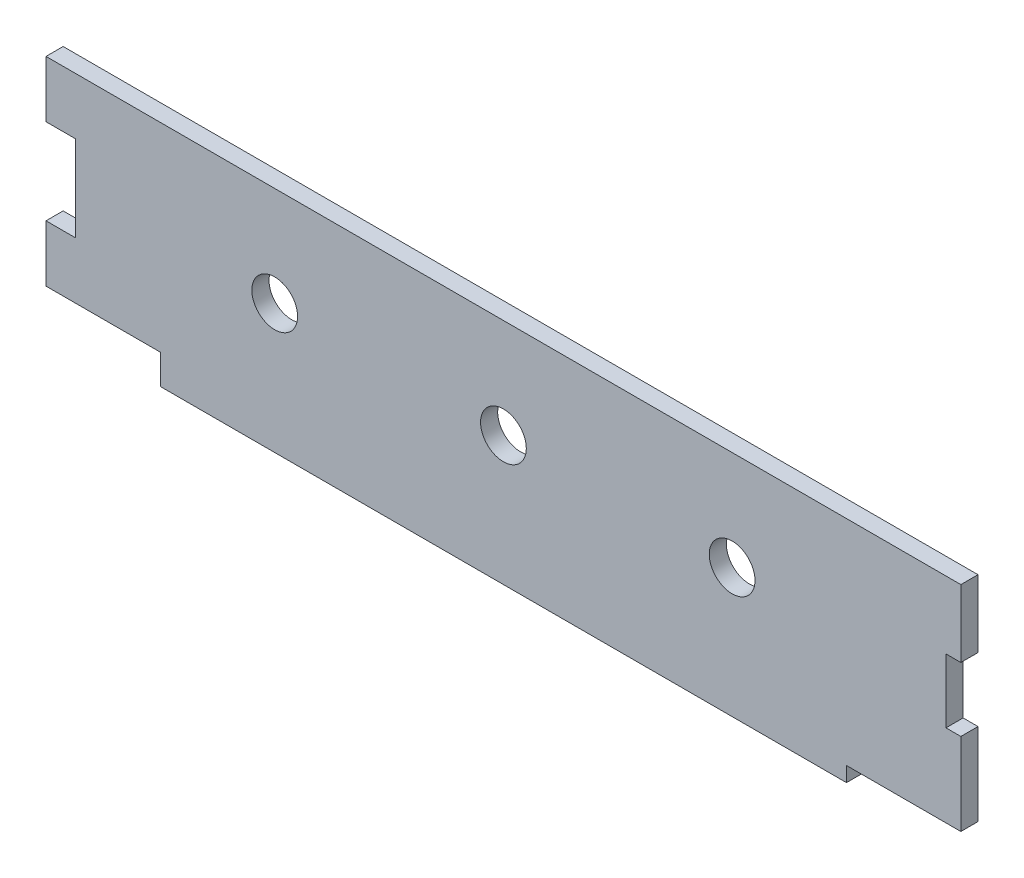
ISO-10303-21;
HEADER;
FILE_DESCRIPTION(('STEP AP214'),'2;1');
FILE_NAME('part.step','',(''),(''),'','','');
FILE_SCHEMA(('AUTOMOTIVE_DESIGN { 1 0 10303 214 1 1 1 1 }'));
ENDSEC;
DATA;
#1=APPLICATION_CONTEXT('core data for automotive mechanical design processes');
#2=APPLICATION_PROTOCOL_DEFINITION('international standard','automotive_design',2000,#1);
#3=PRODUCT_CONTEXT('',#1,'mechanical');
#4=PRODUCT('Part','Part','',(#3));
#5=PRODUCT_RELATED_PRODUCT_CATEGORY('part','',(#4));
#6=PRODUCT_DEFINITION_FORMATION('','',#4);
#7=PRODUCT_DEFINITION_CONTEXT('part definition',#1,'design');
#8=PRODUCT_DEFINITION('design','',#6,#7);
#9=PRODUCT_DEFINITION_SHAPE('','',#8);
#10=(LENGTH_UNIT() NAMED_UNIT(*) SI_UNIT(.MILLI.,.METRE.));
#11=(NAMED_UNIT(*) PLANE_ANGLE_UNIT() SI_UNIT($,.RADIAN.));
#12=(NAMED_UNIT(*) SI_UNIT($,.STERADIAN.) SOLID_ANGLE_UNIT());
#13=UNCERTAINTY_MEASURE_WITH_UNIT(LENGTH_MEASURE(1.E-05),#10,'distance_accuracy_value','');
#14=(GEOMETRIC_REPRESENTATION_CONTEXT(3) GLOBAL_UNCERTAINTY_ASSIGNED_CONTEXT((#13)) GLOBAL_UNIT_ASSIGNED_CONTEXT((#10,
#11,#12)) REPRESENTATION_CONTEXT('',''));
#15=CARTESIAN_POINT('',(0.,0.,0.));
#16=DIRECTION('',(0.,0.,1.));
#17=DIRECTION('',(1.,0.,0.));
#18=AXIS2_PLACEMENT_3D('',#15,#16,#17);
#19=CARTESIAN_POINT('',(0.,0.,1.5));
#20=DIRECTION('',(0.,0.,-1.));
#21=DIRECTION('',(-1.,0.,0.));
#22=AXIS2_PLACEMENT_3D('',#19,#20,#21);
#23=PLANE('',#22);
#24=DIRECTION('',(0.,-1.,0.));
#25=VECTOR('',#24,1.);
#26=CARTESIAN_POINT('',(-40.,3.74999999999999,1.5));
#27=LINE('',#26,#25);
#28=CARTESIAN_POINT('',(-40.0000000000001,8.7,1.5));
#29=VERTEX_POINT('',#28);
#30=CARTESIAN_POINT('',(-40.,3.74999999999999,1.5));
#31=VERTEX_POINT('',#30);
#32=EDGE_CURVE('E209',#29,#31,#27,.T.);
#33=ORIENTED_EDGE('',*,*,#32,.T.);
#34=DIRECTION('',(1.,0.,0.));
#35=VECTOR('',#34,1.);
#36=CARTESIAN_POINT('',(-37.4,3.74999999999999,1.5));
#37=LINE('',#36,#35);
#38=CARTESIAN_POINT('',(-37.4,3.74999999999999,1.5));
#39=VERTEX_POINT('',#38);
#40=EDGE_CURVE('E117',#31,#39,#37,.T.);
#41=ORIENTED_EDGE('',*,*,#40,.T.);
#42=DIRECTION('',(0.,-1.,0.));
#43=VECTOR('',#42,1.);
#44=CARTESIAN_POINT('',(-37.4,-3.75000000000001,1.5));
#45=LINE('',#44,#43);
#46=CARTESIAN_POINT('',(-37.4,-3.75000000000001,1.5));
#47=VERTEX_POINT('',#46);
#48=EDGE_CURVE('E248',#39,#47,#45,.T.);
#49=ORIENTED_EDGE('',*,*,#48,.T.);
#50=DIRECTION('',(-1.,0.,0.));
#51=VECTOR('',#50,1.);
#52=CARTESIAN_POINT('',(-40.,-3.75000000000001,1.5));
#53=LINE('',#52,#51);
#54=CARTESIAN_POINT('',(-40.,-3.75000000000001,1.5));
#55=VERTEX_POINT('',#54);
#56=EDGE_CURVE('E267',#47,#55,#53,.T.);
#57=ORIENTED_EDGE('',*,*,#56,.T.);
#58=DIRECTION('',(0.,-1.,0.));
#59=VECTOR('',#58,1.);
#60=CARTESIAN_POINT('',(-40.,-8.70000000000001,1.5));
#61=LINE('',#60,#59);
#62=CARTESIAN_POINT('',(-40.,-8.70000000000001,1.5));
#63=VERTEX_POINT('',#62);
#64=EDGE_CURVE('E264',#55,#63,#61,.T.);
#65=ORIENTED_EDGE('',*,*,#64,.T.);
#66=DIRECTION('',(1.,0.,0.));
#67=VECTOR('',#66,1.);
#68=CARTESIAN_POINT('',(-30.,-8.70000000000001,1.5));
#69=LINE('',#68,#67);
#70=CARTESIAN_POINT('',(-30.,-8.70000000000001,1.5));
#71=VERTEX_POINT('',#70);
#72=EDGE_CURVE('E266',#63,#71,#69,.T.);
#73=ORIENTED_EDGE('',*,*,#72,.T.);
#74=DIRECTION('',(0.,-1.,0.));
#75=VECTOR('',#74,1.);
#76=CARTESIAN_POINT('',(-30.,-11.3,1.5));
#77=LINE('',#76,#75);
#78=CARTESIAN_POINT('',(-30.,-11.3,1.5));
#79=VERTEX_POINT('',#78);
#80=EDGE_CURVE('E269',#71,#79,#77,.T.);
#81=ORIENTED_EDGE('',*,*,#80,.T.);
#82=DIRECTION('',(1.,0.,0.));
#83=VECTOR('',#82,1.);
#84=CARTESIAN_POINT('',(30.,-11.3,1.5));
#85=LINE('',#84,#83);
#86=CARTESIAN_POINT('',(30.,-11.3,1.5));
#87=VERTEX_POINT('',#86);
#88=EDGE_CURVE('E275',#79,#87,#85,.T.);
#89=ORIENTED_EDGE('',*,*,#88,.T.);
#90=DIRECTION('',(0.,1.,0.));
#91=VECTOR('',#90,1.);
#92=CARTESIAN_POINT('',(30.,-9.99999999999999,1.5));
#93=LINE('',#92,#91);
#94=CARTESIAN_POINT('',(30.,-9.99999999999999,1.5));
#95=VERTEX_POINT('',#94);
#96=EDGE_CURVE('E277',#87,#95,#93,.T.);
#97=ORIENTED_EDGE('',*,*,#96,.T.);
#98=DIRECTION('',(1.,0.,0.));
#99=VECTOR('',#98,1.);
#100=CARTESIAN_POINT('',(40.,-9.99999999999999,1.5));
#101=LINE('',#100,#99);
#102=CARTESIAN_POINT('',(40.,-9.99999999999999,1.5));
#103=VERTEX_POINT('',#102);
#104=EDGE_CURVE('E279',#95,#103,#101,.T.);
#105=ORIENTED_EDGE('',*,*,#104,.T.);
#106=DIRECTION('',(0.,1.,0.));
#107=VECTOR('',#106,1.);
#108=CARTESIAN_POINT('',(40.,-2.8,1.5));
#109=LINE('',#108,#107);
#110=CARTESIAN_POINT('',(40.,-2.8,1.5));
#111=VERTEX_POINT('',#110);
#112=EDGE_CURVE('E281',#103,#111,#109,.T.);
#113=ORIENTED_EDGE('',*,*,#112,.T.);
#114=DIRECTION('',(-1.,0.,0.));
#115=VECTOR('',#114,1.);
#116=CARTESIAN_POINT('',(38.7,-2.8,1.5));
#117=LINE('',#116,#115);
#118=CARTESIAN_POINT('',(38.7,-2.8,1.5));
#119=VERTEX_POINT('',#118);
#120=EDGE_CURVE('E283',#111,#119,#117,.T.);
#121=ORIENTED_EDGE('',*,*,#120,.T.);
#122=DIRECTION('',(0.,1.,0.));
#123=VECTOR('',#122,1.);
#124=CARTESIAN_POINT('',(38.7,2.8,1.5));
#125=LINE('',#124,#123);
#126=CARTESIAN_POINT('',(38.7,2.8,1.5));
#127=VERTEX_POINT('',#126);
#128=EDGE_CURVE('E160',#119,#127,#125,.T.);
#129=ORIENTED_EDGE('',*,*,#128,.T.);
#130=DIRECTION('',(1.,0.,0.));
#131=VECTOR('',#130,1.);
#132=CARTESIAN_POINT('',(40.,2.8,1.5));
#133=LINE('',#132,#131);
#134=CARTESIAN_POINT('',(40.,2.8,1.5));
#135=VERTEX_POINT('',#134);
#136=EDGE_CURVE('E154',#127,#135,#133,.T.);
#137=ORIENTED_EDGE('',*,*,#136,.T.);
#138=DIRECTION('',(0.,1.,0.));
#139=VECTOR('',#138,1.);
#140=CARTESIAN_POINT('',(40.0000000000001,8.7,1.5));
#141=LINE('',#140,#139);
#142=CARTESIAN_POINT('',(40.0000000000001,8.7,1.5));
#143=VERTEX_POINT('',#142);
#144=EDGE_CURVE('E158',#135,#143,#141,.T.);
#145=ORIENTED_EDGE('',*,*,#144,.T.);
#146=DIRECTION('',(-1.,0.,0.));
#147=VECTOR('',#146,1.);
#148=CARTESIAN_POINT('',(-40.0000000000001,8.7,1.5));
#149=LINE('',#148,#147);
#150=EDGE_CURVE('E50',#143,#29,#149,.T.);
#151=ORIENTED_EDGE('',*,*,#150,.T.);
#152=EDGE_LOOP('',(#33,#41,#49,#57,#65,#73,#81,#89,#97,#105,#113,#121,#129,#137,#145,#151));
#153=FACE_BOUND('',#152,.T.);
#154=CARTESIAN_POINT('',(20.,0.,1.5));
#155=DIRECTION('',(0.,0.,1.));
#156=DIRECTION('',(1.,0.,0.));
#157=AXIS2_PLACEMENT_3D('',#154,#155,#156);
#158=CIRCLE('',#157,2.00000000000003);
#159=CARTESIAN_POINT('',(22.,0.,1.5));
#160=VERTEX_POINT('',#159);
#161=EDGE_CURVE('E182',#160,#160,#158,.T.);
#162=ORIENTED_EDGE('',*,*,#161,.F.);
#163=EDGE_LOOP('',(#162));
#164=FACE_BOUND('',#163,.T.);
#165=CARTESIAN_POINT('',(0.,0.,1.5));
#166=DIRECTION('',(0.,0.,1.));
#167=DIRECTION('',(1.,0.,0.));
#168=AXIS2_PLACEMENT_3D('',#165,#166,#167);
#169=CIRCLE('',#168,2.00000000000002);
#170=CARTESIAN_POINT('',(2.,0.,1.5));
#171=VERTEX_POINT('',#170);
#172=EDGE_CURVE('E337',#171,#171,#169,.T.);
#173=ORIENTED_EDGE('',*,*,#172,.F.);
#174=EDGE_LOOP('',(#173));
#175=FACE_BOUND('',#174,.T.);
#176=CARTESIAN_POINT('',(-20.,0.,1.5));
#177=DIRECTION('',(0.,0.,1.));
#178=DIRECTION('',(1.,0.,0.));
#179=AXIS2_PLACEMENT_3D('',#176,#177,#178);
#180=CIRCLE('',#179,2.00000000000003);
#181=CARTESIAN_POINT('',(-18.,0.,1.5));
#182=VERTEX_POINT('',#181);
#183=EDGE_CURVE('E328',#182,#182,#180,.T.);
#184=ORIENTED_EDGE('',*,*,#183,.F.);
#185=EDGE_LOOP('',(#184));
#186=FACE_BOUND('',#185,.T.);
#187=ADVANCED_FACE('F33',(#153,#164,#175,#186),#23,.F.);
#188=CARTESIAN_POINT('',(0.,0.,0.));
#189=DIRECTION('',(0.,0.,-1.));
#190=DIRECTION('',(-1.,0.,0.));
#191=AXIS2_PLACEMENT_3D('',#188,#189,#190);
#192=PLANE('',#191);
#193=CARTESIAN_POINT('',(0.,0.,0.));
#194=DIRECTION('',(0.,0.,1.));
#195=DIRECTION('',(1.,0.,0.));
#196=AXIS2_PLACEMENT_3D('',#193,#194,#195);
#197=CIRCLE('',#196,2.00000000000002);
#198=CARTESIAN_POINT('',(2.,0.,0.));
#199=VERTEX_POINT('',#198);
#200=EDGE_CURVE('E334',#199,#199,#197,.T.);
#201=ORIENTED_EDGE('',*,*,#200,.T.);
#202=EDGE_LOOP('',(#201));
#203=FACE_BOUND('',#202,.T.);
#204=DIRECTION('',(0.,-1.,0.));
#205=VECTOR('',#204,1.);
#206=CARTESIAN_POINT('',(-40.,3.74999999999999,0.));
#207=LINE('',#206,#205);
#208=CARTESIAN_POINT('',(-40.0000000000001,8.7,0.));
#209=VERTEX_POINT('',#208);
#210=CARTESIAN_POINT('',(-40.,3.74999999999999,0.));
#211=VERTEX_POINT('',#210);
#212=EDGE_CURVE('E178',#209,#211,#207,.T.);
#213=ORIENTED_EDGE('',*,*,#212,.F.);
#214=DIRECTION('',(-1.,0.,0.));
#215=VECTOR('',#214,1.);
#216=CARTESIAN_POINT('',(-40.0000000000001,8.7,0.));
#217=LINE('',#216,#215);
#218=CARTESIAN_POINT('',(40.0000000000001,8.7,0.));
#219=VERTEX_POINT('',#218);
#220=EDGE_CURVE('E109',#219,#209,#217,.T.);
#221=ORIENTED_EDGE('',*,*,#220,.F.);
#222=DIRECTION('',(0.,1.,0.));
#223=VECTOR('',#222,1.);
#224=CARTESIAN_POINT('',(40.0000000000001,8.7,0.));
#225=LINE('',#224,#223);
#226=CARTESIAN_POINT('',(40.,2.8,0.));
#227=VERTEX_POINT('',#226);
#228=EDGE_CURVE('E103',#227,#219,#225,.T.);
#229=ORIENTED_EDGE('',*,*,#228,.F.);
#230=DIRECTION('',(1.,0.,0.));
#231=VECTOR('',#230,1.);
#232=CARTESIAN_POINT('',(40.,2.8,0.));
#233=LINE('',#232,#231);
#234=CARTESIAN_POINT('',(38.7,2.8,0.));
#235=VERTEX_POINT('',#234);
#236=EDGE_CURVE('E168',#235,#227,#233,.T.);
#237=ORIENTED_EDGE('',*,*,#236,.F.);
#238=DIRECTION('',(0.,1.,0.));
#239=VECTOR('',#238,1.);
#240=CARTESIAN_POINT('',(38.7,2.8,0.));
#241=LINE('',#240,#239);
#242=CARTESIAN_POINT('',(38.7,-2.8,0.));
#243=VERTEX_POINT('',#242);
#244=EDGE_CURVE('E204',#243,#235,#241,.T.);
#245=ORIENTED_EDGE('',*,*,#244,.F.);
#246=DIRECTION('',(-1.,0.,0.));
#247=VECTOR('',#246,1.);
#248=CARTESIAN_POINT('',(38.7,-2.8,0.));
#249=LINE('',#248,#247);
#250=CARTESIAN_POINT('',(40.,-2.8,0.));
#251=VERTEX_POINT('',#250);
#252=EDGE_CURVE('E202',#251,#243,#249,.T.);
#253=ORIENTED_EDGE('',*,*,#252,.F.);
#254=DIRECTION('',(0.,1.,0.));
#255=VECTOR('',#254,1.);
#256=CARTESIAN_POINT('',(40.,-2.8,0.));
#257=LINE('',#256,#255);
#258=CARTESIAN_POINT('',(40.,-9.99999999999999,0.));
#259=VERTEX_POINT('',#258);
#260=EDGE_CURVE('E200',#259,#251,#257,.T.);
#261=ORIENTED_EDGE('',*,*,#260,.F.);
#262=DIRECTION('',(1.,0.,0.));
#263=VECTOR('',#262,1.);
#264=CARTESIAN_POINT('',(40.,-9.99999999999999,0.));
#265=LINE('',#264,#263);
#266=CARTESIAN_POINT('',(30.,-9.99999999999999,0.));
#267=VERTEX_POINT('',#266);
#268=EDGE_CURVE('E198',#267,#259,#265,.T.);
#269=ORIENTED_EDGE('',*,*,#268,.F.);
#270=DIRECTION('',(0.,1.,0.));
#271=VECTOR('',#270,1.);
#272=CARTESIAN_POINT('',(30.,-9.99999999999999,0.));
#273=LINE('',#272,#271);
#274=CARTESIAN_POINT('',(30.,-11.3,0.));
#275=VERTEX_POINT('',#274);
#276=EDGE_CURVE('E196',#275,#267,#273,.T.);
#277=ORIENTED_EDGE('',*,*,#276,.F.);
#278=DIRECTION('',(1.,0.,0.));
#279=VECTOR('',#278,1.);
#280=CARTESIAN_POINT('',(30.,-11.3,0.));
#281=LINE('',#280,#279);
#282=CARTESIAN_POINT('',(-30.,-11.3,0.));
#283=VERTEX_POINT('',#282);
#284=EDGE_CURVE('E194',#283,#275,#281,.T.);
#285=ORIENTED_EDGE('',*,*,#284,.F.);
#286=DIRECTION('',(0.,-1.,0.));
#287=VECTOR('',#286,1.);
#288=CARTESIAN_POINT('',(-30.,-11.3,0.));
#289=LINE('',#288,#287);
#290=CARTESIAN_POINT('',(-30.,-8.70000000000001,0.));
#291=VERTEX_POINT('',#290);
#292=EDGE_CURVE('E192',#291,#283,#289,.T.);
#293=ORIENTED_EDGE('',*,*,#292,.F.);
#294=DIRECTION('',(1.,0.,0.));
#295=VECTOR('',#294,1.);
#296=CARTESIAN_POINT('',(-30.,-8.70000000000001,0.));
#297=LINE('',#296,#295);
#298=CARTESIAN_POINT('',(-40.,-8.70000000000001,0.));
#299=VERTEX_POINT('',#298);
#300=EDGE_CURVE('E190',#299,#291,#297,.T.);
#301=ORIENTED_EDGE('',*,*,#300,.F.);
#302=DIRECTION('',(0.,-1.,0.));
#303=VECTOR('',#302,1.);
#304=CARTESIAN_POINT('',(-40.,-8.70000000000001,0.));
#305=LINE('',#304,#303);
#306=CARTESIAN_POINT('',(-40.,-3.75000000000001,0.));
#307=VERTEX_POINT('',#306);
#308=EDGE_CURVE('E188',#307,#299,#305,.T.);
#309=ORIENTED_EDGE('',*,*,#308,.F.);
#310=DIRECTION('',(-1.,0.,0.));
#311=VECTOR('',#310,1.);
#312=CARTESIAN_POINT('',(-40.,-3.75000000000001,0.));
#313=LINE('',#312,#311);
#314=CARTESIAN_POINT('',(-37.4,-3.75000000000001,0.));
#315=VERTEX_POINT('',#314);
#316=EDGE_CURVE('E186',#315,#307,#313,.T.);
#317=ORIENTED_EDGE('',*,*,#316,.F.);
#318=DIRECTION('',(0.,-1.,0.));
#319=VECTOR('',#318,1.);
#320=CARTESIAN_POINT('',(-37.4,-3.75000000000001,0.));
#321=LINE('',#320,#319);
#322=CARTESIAN_POINT('',(-37.4,3.74999999999999,0.));
#323=VERTEX_POINT('',#322);
#324=EDGE_CURVE('E184',#323,#315,#321,.T.);
#325=ORIENTED_EDGE('',*,*,#324,.F.);
#326=DIRECTION('',(1.,0.,0.));
#327=VECTOR('',#326,1.);
#328=CARTESIAN_POINT('',(-37.4,3.74999999999999,0.));
#329=LINE('',#328,#327);
#330=EDGE_CURVE('E181',#211,#323,#329,.T.);
#331=ORIENTED_EDGE('',*,*,#330,.F.);
#332=EDGE_LOOP('',(#213,#221,#229,#237,#245,#253,#261,#269,#277,#285,#293,#301,#309,#317,#325,#331));
#333=FACE_BOUND('',#332,.T.);
#334=CARTESIAN_POINT('',(20.,0.,0.));
#335=DIRECTION('',(0.,0.,1.));
#336=DIRECTION('',(1.,0.,0.));
#337=AXIS2_PLACEMENT_3D('',#334,#335,#336);
#338=CIRCLE('',#337,2.00000000000003);
#339=CARTESIAN_POINT('',(22.,0.,0.));
#340=VERTEX_POINT('',#339);
#341=EDGE_CURVE('E340',#340,#340,#338,.T.);
#342=ORIENTED_EDGE('',*,*,#341,.T.);
#343=EDGE_LOOP('',(#342));
#344=FACE_BOUND('',#343,.T.);
#345=CARTESIAN_POINT('',(-20.,0.,0.));
#346=DIRECTION('',(0.,0.,1.));
#347=DIRECTION('',(1.,0.,0.));
#348=AXIS2_PLACEMENT_3D('',#345,#346,#347);
#349=CIRCLE('',#348,2.00000000000003);
#350=CARTESIAN_POINT('',(-18.,0.,0.));
#351=VERTEX_POINT('',#350);
#352=EDGE_CURVE('E331',#351,#351,#349,.T.);
#353=ORIENTED_EDGE('',*,*,#352,.T.);
#354=EDGE_LOOP('',(#353));
#355=FACE_BOUND('',#354,.T.);
#356=ADVANCED_FACE('F252',(#203,#333,#344,#355),#192,.T.);
#357=CARTESIAN_POINT('',(-40.,3.74999999999999,1.5));
#358=DIRECTION('',(1.,0.,0.));
#359=DIRECTION('',(0.,1.,0.));
#360=AXIS2_PLACEMENT_3D('',#357,#358,#359);
#361=PLANE('',#360);
#362=ORIENTED_EDGE('',*,*,#212,.T.);
#363=DIRECTION('',(0.,0.,-1.));
#364=VECTOR('',#363,1.);
#365=CARTESIAN_POINT('',(-40.,3.74999999999999,1.5));
#366=LINE('',#365,#364);
#367=EDGE_CURVE('E11',#31,#211,#366,.T.);
#368=ORIENTED_EDGE('',*,*,#367,.F.);
#369=ORIENTED_EDGE('',*,*,#32,.F.);
#370=DIRECTION('',(0.,0.,-1.));
#371=VECTOR('',#370,1.);
#372=CARTESIAN_POINT('',(-40.0000000000001,8.7,1.5));
#373=LINE('',#372,#371);
#374=EDGE_CURVE('E174',#29,#209,#373,.T.);
#375=ORIENTED_EDGE('',*,*,#374,.T.);
#376=EDGE_LOOP('',(#362,#368,#369,#375));
#377=FACE_BOUND('',#376,.T.);
#378=ADVANCED_FACE('F35',(#377),#361,.F.);
#379=CARTESIAN_POINT('',(-37.4,3.74999999999999,1.5));
#380=DIRECTION('',(0.,1.,0.));
#381=DIRECTION('',(-1.,0.,0.));
#382=AXIS2_PLACEMENT_3D('',#379,#380,#381);
#383=PLANE('',#382);
#384=ORIENTED_EDGE('',*,*,#330,.T.);
#385=DIRECTION('',(0.,0.,-1.));
#386=VECTOR('',#385,1.);
#387=CARTESIAN_POINT('',(-37.4,3.74999999999999,1.5));
#388=LINE('',#387,#386);
#389=EDGE_CURVE('E42',#39,#323,#388,.T.);
#390=ORIENTED_EDGE('',*,*,#389,.F.);
#391=ORIENTED_EDGE('',*,*,#40,.F.);
#392=ORIENTED_EDGE('',*,*,#367,.T.);
#393=EDGE_LOOP('',(#384,#390,#391,#392));
#394=FACE_BOUND('',#393,.T.);
#395=ADVANCED_FACE('F483',(#394),#383,.F.);
#396=CARTESIAN_POINT('',(-37.4,-3.75000000000001,1.5));
#397=DIRECTION('',(1.,0.,0.));
#398=DIRECTION('',(0.,1.,0.));
#399=AXIS2_PLACEMENT_3D('',#396,#397,#398);
#400=PLANE('',#399);
#401=ORIENTED_EDGE('',*,*,#324,.T.);
#402=DIRECTION('',(0.,0.,-1.));
#403=VECTOR('',#402,1.);
#404=CARTESIAN_POINT('',(-37.4,-3.75000000000001,1.5));
#405=LINE('',#404,#403);
#406=EDGE_CURVE('E240',#47,#315,#405,.T.);
#407=ORIENTED_EDGE('',*,*,#406,.F.);
#408=ORIENTED_EDGE('',*,*,#48,.F.);
#409=ORIENTED_EDGE('',*,*,#389,.T.);
#410=EDGE_LOOP('',(#401,#407,#408,#409));
#411=FACE_BOUND('',#410,.T.);
#412=ADVANCED_FACE('F246',(#411),#400,.F.);
#413=CARTESIAN_POINT('',(-40.,-3.75000000000001,1.5));
#414=DIRECTION('',(0.,-1.,0.));
#415=DIRECTION('',(0.,0.,-1.));
#416=AXIS2_PLACEMENT_3D('',#413,#414,#415);
#417=PLANE('',#416);
#418=ORIENTED_EDGE('',*,*,#316,.T.);
#419=DIRECTION('',(0.,0.,-1.));
#420=VECTOR('',#419,1.);
#421=CARTESIAN_POINT('',(-40.,-3.75000000000001,1.5));
#422=LINE('',#421,#420);
#423=EDGE_CURVE('E237',#55,#307,#422,.T.);
#424=ORIENTED_EDGE('',*,*,#423,.F.);
#425=ORIENTED_EDGE('',*,*,#56,.F.);
#426=ORIENTED_EDGE('',*,*,#406,.T.);
#427=EDGE_LOOP('',(#418,#424,#425,#426));
#428=FACE_BOUND('',#427,.T.);
#429=ADVANCED_FACE('F258',(#428),#417,.F.);
#430=CARTESIAN_POINT('',(-40.,-8.70000000000001,1.5));
#431=DIRECTION('',(1.,0.,0.));
#432=DIRECTION('',(0.,1.,0.));
#433=AXIS2_PLACEMENT_3D('',#430,#431,#432);
#434=PLANE('',#433);
#435=ORIENTED_EDGE('',*,*,#308,.T.);
#436=DIRECTION('',(0.,0.,-1.));
#437=VECTOR('',#436,1.);
#438=CARTESIAN_POINT('',(-40.,-8.70000000000001,1.5));
#439=LINE('',#438,#437);
#440=EDGE_CURVE('E234',#63,#299,#439,.T.);
#441=ORIENTED_EDGE('',*,*,#440,.F.);
#442=ORIENTED_EDGE('',*,*,#64,.F.);
#443=ORIENTED_EDGE('',*,*,#423,.T.);
#444=EDGE_LOOP('',(#435,#441,#442,#443));
#445=FACE_BOUND('',#444,.T.);
#446=ADVANCED_FACE('F262',(#445),#434,.F.);
#447=CARTESIAN_POINT('',(-30.,-8.70000000000001,1.5));
#448=DIRECTION('',(0.,1.,0.));
#449=DIRECTION('',(-1.,0.,0.));
#450=AXIS2_PLACEMENT_3D('',#447,#448,#449);
#451=PLANE('',#450);
#452=ORIENTED_EDGE('',*,*,#300,.T.);
#453=DIRECTION('',(0.,0.,-1.));
#454=VECTOR('',#453,1.);
#455=CARTESIAN_POINT('',(-30.,-8.70000000000001,1.5));
#456=LINE('',#455,#454);
#457=EDGE_CURVE('E231',#71,#291,#456,.T.);
#458=ORIENTED_EDGE('',*,*,#457,.F.);
#459=ORIENTED_EDGE('',*,*,#72,.F.);
#460=ORIENTED_EDGE('',*,*,#440,.T.);
#461=EDGE_LOOP('',(#452,#458,#459,#460));
#462=FACE_BOUND('',#461,.T.);
#463=ADVANCED_FACE('F448',(#462),#451,.F.);
#464=CARTESIAN_POINT('',(-30.,-11.3,1.5));
#465=DIRECTION('',(1.,0.,0.));
#466=DIRECTION('',(0.,1.,0.));
#467=AXIS2_PLACEMENT_3D('',#464,#465,#466);
#468=PLANE('',#467);
#469=ORIENTED_EDGE('',*,*,#292,.T.);
#470=DIRECTION('',(0.,0.,-1.));
#471=VECTOR('',#470,1.);
#472=CARTESIAN_POINT('',(-30.,-11.3,1.5));
#473=LINE('',#472,#471);
#474=EDGE_CURVE('E228',#79,#283,#473,.T.);
#475=ORIENTED_EDGE('',*,*,#474,.F.);
#476=ORIENTED_EDGE('',*,*,#80,.F.);
#477=ORIENTED_EDGE('',*,*,#457,.T.);
#478=EDGE_LOOP('',(#469,#475,#476,#477));
#479=FACE_BOUND('',#478,.T.);
#480=ADVANCED_FACE('F438',(#479),#468,.F.);
#481=CARTESIAN_POINT('',(30.,-11.3,1.5));
#482=DIRECTION('',(0.,1.,0.));
#483=DIRECTION('',(-1.,0.,0.));
#484=AXIS2_PLACEMENT_3D('',#481,#482,#483);
#485=PLANE('',#484);
#486=ORIENTED_EDGE('',*,*,#284,.T.);
#487=DIRECTION('',(0.,0.,-1.));
#488=VECTOR('',#487,1.);
#489=CARTESIAN_POINT('',(30.,-11.3,1.5));
#490=LINE('',#489,#488);
#491=EDGE_CURVE('E225',#87,#275,#490,.T.);
#492=ORIENTED_EDGE('',*,*,#491,.F.);
#493=ORIENTED_EDGE('',*,*,#88,.F.);
#494=ORIENTED_EDGE('',*,*,#474,.T.);
#495=EDGE_LOOP('',(#486,#492,#493,#494));
#496=FACE_BOUND('',#495,.T.);
#497=ADVANCED_FACE('F428',(#496),#485,.F.);
#498=CARTESIAN_POINT('',(30.,-9.99999999999999,1.5));
#499=DIRECTION('',(-1.,0.,0.));
#500=DIRECTION('',(0.,-1.,0.));
#501=AXIS2_PLACEMENT_3D('',#498,#499,#500);
#502=PLANE('',#501);
#503=ORIENTED_EDGE('',*,*,#276,.T.);
#504=DIRECTION('',(0.,0.,-1.));
#505=VECTOR('',#504,1.);
#506=CARTESIAN_POINT('',(30.,-9.99999999999999,1.5));
#507=LINE('',#506,#505);
#508=EDGE_CURVE('E222',#95,#267,#507,.T.);
#509=ORIENTED_EDGE('',*,*,#508,.F.);
#510=ORIENTED_EDGE('',*,*,#96,.F.);
#511=ORIENTED_EDGE('',*,*,#491,.T.);
#512=EDGE_LOOP('',(#503,#509,#510,#511));
#513=FACE_BOUND('',#512,.T.);
#514=ADVANCED_FACE('F418',(#513),#502,.F.);
#515=CARTESIAN_POINT('',(40.,-9.99999999999999,1.5));
#516=DIRECTION('',(0.,1.,0.));
#517=DIRECTION('',(0.,0.,1.));
#518=AXIS2_PLACEMENT_3D('',#515,#516,#517);
#519=PLANE('',#518);
#520=ORIENTED_EDGE('',*,*,#268,.T.);
#521=DIRECTION('',(0.,0.,-1.));
#522=VECTOR('',#521,1.);
#523=CARTESIAN_POINT('',(40.,-9.99999999999999,1.5));
#524=LINE('',#523,#522);
#525=EDGE_CURVE('E219',#103,#259,#524,.T.);
#526=ORIENTED_EDGE('',*,*,#525,.F.);
#527=ORIENTED_EDGE('',*,*,#104,.F.);
#528=ORIENTED_EDGE('',*,*,#508,.T.);
#529=EDGE_LOOP('',(#520,#526,#527,#528));
#530=FACE_BOUND('',#529,.T.);
#531=ADVANCED_FACE('F408',(#530),#519,.F.);
#532=CARTESIAN_POINT('',(40.,-2.8,1.5));
#533=DIRECTION('',(-1.,0.,0.));
#534=DIRECTION('',(0.,-1.,0.));
#535=AXIS2_PLACEMENT_3D('',#532,#533,#534);
#536=PLANE('',#535);
#537=ORIENTED_EDGE('',*,*,#260,.T.);
#538=DIRECTION('',(0.,0.,-1.));
#539=VECTOR('',#538,1.);
#540=CARTESIAN_POINT('',(40.,-2.8,1.5));
#541=LINE('',#540,#539);
#542=EDGE_CURVE('E216',#111,#251,#541,.T.);
#543=ORIENTED_EDGE('',*,*,#542,.F.);
#544=ORIENTED_EDGE('',*,*,#112,.F.);
#545=ORIENTED_EDGE('',*,*,#525,.T.);
#546=EDGE_LOOP('',(#537,#543,#544,#545));
#547=FACE_BOUND('',#546,.T.);
#548=ADVANCED_FACE('F399',(#547),#536,.F.);
#549=CARTESIAN_POINT('',(38.7,-2.8,1.5));
#550=DIRECTION('',(0.,-1.,0.));
#551=DIRECTION('',(0.,0.,-1.));
#552=AXIS2_PLACEMENT_3D('',#549,#550,#551);
#553=PLANE('',#552);
#554=ORIENTED_EDGE('',*,*,#252,.T.);
#555=DIRECTION('',(0.,0.,-1.));
#556=VECTOR('',#555,1.);
#557=CARTESIAN_POINT('',(38.7,-2.8,1.5));
#558=LINE('',#557,#556);
#559=EDGE_CURVE('E213',#119,#243,#558,.T.);
#560=ORIENTED_EDGE('',*,*,#559,.F.);
#561=ORIENTED_EDGE('',*,*,#120,.F.);
#562=ORIENTED_EDGE('',*,*,#542,.T.);
#563=EDGE_LOOP('',(#554,#560,#561,#562));
#564=FACE_BOUND('',#563,.T.);
#565=ADVANCED_FACE('F289',(#564),#553,.F.);
#566=CARTESIAN_POINT('',(38.7,2.8,1.5));
#567=DIRECTION('',(-1.,0.,0.));
#568=DIRECTION('',(0.,0.,1.));
#569=AXIS2_PLACEMENT_3D('',#566,#567,#568);
#570=PLANE('',#569);
#571=ORIENTED_EDGE('',*,*,#244,.T.);
#572=DIRECTION('',(0.,0.,-1.));
#573=VECTOR('',#572,1.);
#574=CARTESIAN_POINT('',(38.7,2.8,1.5));
#575=LINE('',#574,#573);
#576=EDGE_CURVE('E169',#127,#235,#575,.T.);
#577=ORIENTED_EDGE('',*,*,#576,.F.);
#578=ORIENTED_EDGE('',*,*,#128,.F.);
#579=ORIENTED_EDGE('',*,*,#559,.T.);
#580=EDGE_LOOP('',(#571,#577,#578,#579));
#581=FACE_BOUND('',#580,.T.);
#582=ADVANCED_FACE('F293',(#581),#570,.F.);
#583=CARTESIAN_POINT('',(40.,2.8,1.5));
#584=DIRECTION('',(0.,1.,0.));
#585=DIRECTION('',(0.,0.,1.));
#586=AXIS2_PLACEMENT_3D('',#583,#584,#585);
#587=PLANE('',#586);
#588=ORIENTED_EDGE('',*,*,#236,.T.);
#589=DIRECTION('',(0.,0.,-1.));
#590=VECTOR('',#589,1.);
#591=CARTESIAN_POINT('',(40.,2.8,1.5));
#592=LINE('',#591,#590);
#593=EDGE_CURVE('E165',#135,#227,#592,.T.);
#594=ORIENTED_EDGE('',*,*,#593,.F.);
#595=ORIENTED_EDGE('',*,*,#136,.F.);
#596=ORIENTED_EDGE('',*,*,#576,.T.);
#597=EDGE_LOOP('',(#588,#594,#595,#596));
#598=FACE_BOUND('',#597,.T.);
#599=ADVANCED_FACE('F166',(#598),#587,.F.);
#600=CARTESIAN_POINT('',(40.0000000000001,8.7,1.5));
#601=DIRECTION('',(-1.,0.,0.));
#602=DIRECTION('',(0.,-1.,0.));
#603=AXIS2_PLACEMENT_3D('',#600,#601,#602);
#604=PLANE('',#603);
#605=ORIENTED_EDGE('',*,*,#228,.T.);
#606=DIRECTION('',(0.,0.,-1.));
#607=VECTOR('',#606,1.);
#608=CARTESIAN_POINT('',(40.0000000000001,8.7,1.5));
#609=LINE('',#608,#607);
#610=EDGE_CURVE('E170',#143,#219,#609,.T.);
#611=ORIENTED_EDGE('',*,*,#610,.F.);
#612=ORIENTED_EDGE('',*,*,#144,.F.);
#613=ORIENTED_EDGE('',*,*,#593,.T.);
#614=EDGE_LOOP('',(#605,#611,#612,#613));
#615=FACE_BOUND('',#614,.T.);
#616=ADVANCED_FACE('F172',(#615),#604,.F.);
#617=CARTESIAN_POINT('',(-40.0000000000001,8.7,1.5));
#618=DIRECTION('',(0.,-1.,0.));
#619=DIRECTION('',(0.,0.,-1.));
#620=AXIS2_PLACEMENT_3D('',#617,#618,#619);
#621=PLANE('',#620);
#622=ORIENTED_EDGE('',*,*,#220,.T.);
#623=ORIENTED_EDGE('',*,*,#374,.F.);
#624=ORIENTED_EDGE('',*,*,#150,.F.);
#625=ORIENTED_EDGE('',*,*,#610,.T.);
#626=EDGE_LOOP('',(#622,#623,#624,#625));
#627=FACE_BOUND('',#626,.T.);
#628=ADVANCED_FACE('F297',(#627),#621,.F.);
#629=CARTESIAN_POINT('',(20.,0.,1.5));
#630=DIRECTION('',(0.,0.,-1.));
#631=DIRECTION('',(-1.,0.,0.));
#632=AXIS2_PLACEMENT_3D('',#629,#630,#631);
#633=CYLINDRICAL_SURFACE('',#632,2.00000000000003);
#634=ORIENTED_EDGE('',*,*,#161,.T.);
#635=EDGE_LOOP('',(#634));
#636=FACE_BOUND('',#635,.T.);
#637=ORIENTED_EDGE('',*,*,#341,.F.);
#638=EDGE_LOOP('',(#637));
#639=FACE_BOUND('',#638,.T.);
#640=ADVANCED_FACE('F299',(#636,#639),#633,.F.);
#641=CARTESIAN_POINT('',(0.,0.,1.5));
#642=DIRECTION('',(0.,0.,-1.));
#643=DIRECTION('',(-1.,0.,0.));
#644=AXIS2_PLACEMENT_3D('',#641,#642,#643);
#645=CYLINDRICAL_SURFACE('',#644,2.00000000000002);
#646=ORIENTED_EDGE('',*,*,#172,.T.);
#647=EDGE_LOOP('',(#646));
#648=FACE_BOUND('',#647,.T.);
#649=ORIENTED_EDGE('',*,*,#200,.F.);
#650=EDGE_LOOP('',(#649));
#651=FACE_BOUND('',#650,.T.);
#652=ADVANCED_FACE('F305',(#648,#651),#645,.F.);
#653=CARTESIAN_POINT('',(-20.,0.,1.5));
#654=DIRECTION('',(0.,0.,-1.));
#655=DIRECTION('',(-1.,0.,0.));
#656=AXIS2_PLACEMENT_3D('',#653,#654,#655);
#657=CYLINDRICAL_SURFACE('',#656,2.00000000000003);
#658=ORIENTED_EDGE('',*,*,#183,.T.);
#659=EDGE_LOOP('',(#658));
#660=FACE_BOUND('',#659,.T.);
#661=ORIENTED_EDGE('',*,*,#352,.F.);
#662=EDGE_LOOP('',(#661));
#663=FACE_BOUND('',#662,.T.);
#664=ADVANCED_FACE('F319',(#660,#663),#657,.F.);
#665=CLOSED_SHELL('',(#187,#356,#378,#395,#412,#429,#446,#463,#480,#497,#514,#531,#548,#565,
#582,#599,#616,#628,#640,#652,#664));
#666=MANIFOLD_SOLID_BREP('B2',#665);
#667=ADVANCED_BREP_SHAPE_REPRESENTATION('',(#18,#666),#14);
#668=SHAPE_DEFINITION_REPRESENTATION(#9,#667);
ENDSEC;
END-ISO-10303-21;
